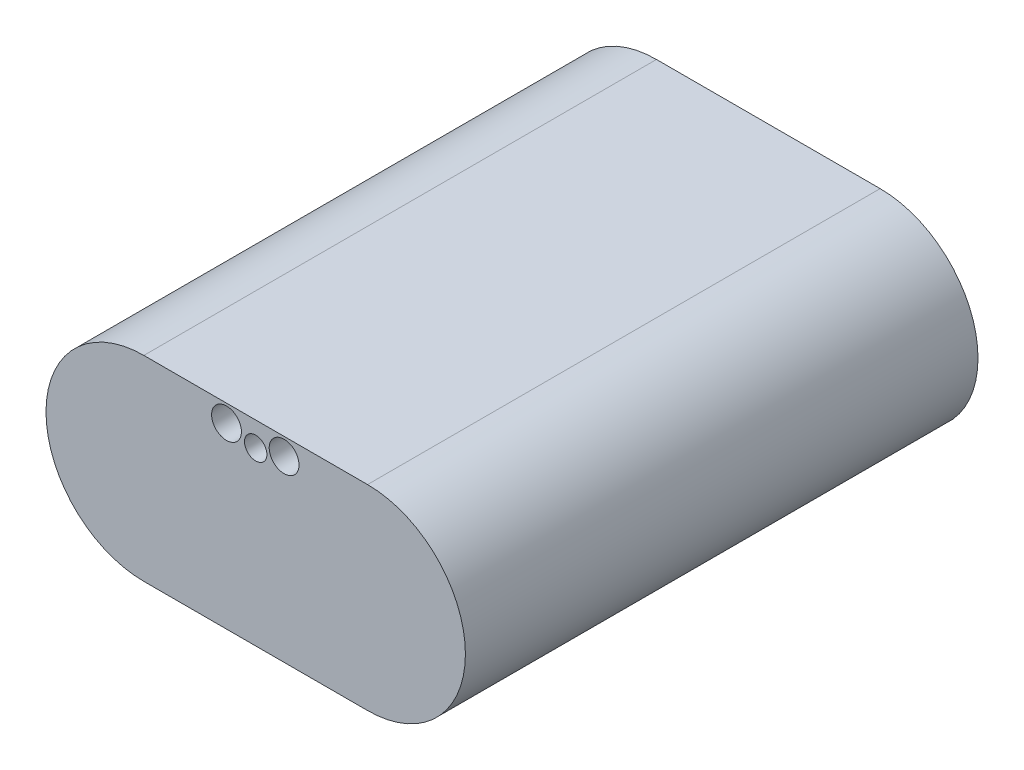
ISO-10303-21;
HEADER;
FILE_DESCRIPTION(('STEP AP214'),'2;1');
FILE_NAME('part.step','',(''),(''),'','','');
FILE_SCHEMA(('AUTOMOTIVE_DESIGN { 1 0 10303 214 1 1 1 1 }'));
ENDSEC;
DATA;
#1=APPLICATION_CONTEXT('core data for automotive mechanical design processes');
#2=APPLICATION_PROTOCOL_DEFINITION('international standard','automotive_design',2000,#1);
#3=PRODUCT_CONTEXT('',#1,'mechanical');
#4=PRODUCT('Part','Part','',(#3));
#5=PRODUCT_RELATED_PRODUCT_CATEGORY('part','',(#4));
#6=PRODUCT_DEFINITION_FORMATION('','',#4);
#7=PRODUCT_DEFINITION_CONTEXT('part definition',#1,'design');
#8=PRODUCT_DEFINITION('design','',#6,#7);
#9=PRODUCT_DEFINITION_SHAPE('','',#8);
#10=(LENGTH_UNIT() NAMED_UNIT(*) SI_UNIT(.MILLI.,.METRE.));
#11=(NAMED_UNIT(*) PLANE_ANGLE_UNIT() SI_UNIT($,.RADIAN.));
#12=(NAMED_UNIT(*) SI_UNIT($,.STERADIAN.) SOLID_ANGLE_UNIT());
#13=UNCERTAINTY_MEASURE_WITH_UNIT(LENGTH_MEASURE(1.E-05),#10,'distance_accuracy_value','');
#14=(GEOMETRIC_REPRESENTATION_CONTEXT(3) GLOBAL_UNCERTAINTY_ASSIGNED_CONTEXT((#13)) GLOBAL_UNIT_ASSIGNED_CONTEXT((#10,
#11,#12)) REPRESENTATION_CONTEXT('',''));
#15=CARTESIAN_POINT('',(0.,0.,0.));
#16=DIRECTION('',(0.,0.,1.));
#17=DIRECTION('',(1.,0.,0.));
#18=AXIS2_PLACEMENT_3D('',#15,#16,#17);
#19=CARTESIAN_POINT('',(-60.,0.,137.5));
#20=DIRECTION('',(0.,0.,-1.));
#21=DIRECTION('',(-1.,0.,0.));
#22=AXIS2_PLACEMENT_3D('',#19,#20,#21);
#23=CYLINDRICAL_SURFACE('',#22,52.5);
#24=CARTESIAN_POINT('',(-60.,0.,-137.5));
#25=DIRECTION('',(0.,0.,1.));
#26=DIRECTION('',(1.,0.,0.));
#27=AXIS2_PLACEMENT_3D('',#24,#25,#26);
#28=CIRCLE('',#27,52.5);
#29=CARTESIAN_POINT('',(-60.,52.5,-137.5));
#30=VERTEX_POINT('',#29);
#31=CARTESIAN_POINT('',(-60.,-52.5,-137.5));
#32=VERTEX_POINT('',#31);
#33=EDGE_CURVE('E117',#30,#32,#28,.T.);
#34=ORIENTED_EDGE('',*,*,#33,.T.);
#35=DIRECTION('',(0.,0.,-1.));
#36=VECTOR('',#35,1.);
#37=CARTESIAN_POINT('',(-60.,-52.5,137.5));
#38=LINE('',#37,#36);
#39=CARTESIAN_POINT('',(-60.,-52.5,137.5));
#40=VERTEX_POINT('',#39);
#41=EDGE_CURVE('E11',#40,#32,#38,.T.);
#42=ORIENTED_EDGE('',*,*,#41,.F.);
#43=CARTESIAN_POINT('',(-60.,0.,137.5));
#44=DIRECTION('',(0.,0.,1.));
#45=DIRECTION('',(1.,0.,0.));
#46=AXIS2_PLACEMENT_3D('',#43,#44,#45);
#47=CIRCLE('',#46,52.5);
#48=CARTESIAN_POINT('',(-60.,52.5,137.5));
#49=VERTEX_POINT('',#48);
#50=EDGE_CURVE('E93',#49,#40,#47,.T.);
#51=ORIENTED_EDGE('',*,*,#50,.F.);
#52=DIRECTION('',(0.,0.,-1.));
#53=VECTOR('',#52,1.);
#54=CARTESIAN_POINT('',(-60.,52.5,137.5));
#55=LINE('',#54,#53);
#56=EDGE_CURVE('E58',#49,#30,#55,.T.);
#57=ORIENTED_EDGE('',*,*,#56,.T.);
#58=EDGE_LOOP('',(#34,#42,#51,#57));
#59=FACE_BOUND('',#58,.T.);
#60=ADVANCED_FACE('F41',(#59),#23,.T.);
#61=CARTESIAN_POINT('',(0.,-52.5,137.5));
#62=DIRECTION('',(0.,1.,0.));
#63=DIRECTION('',(0.,0.,1.));
#64=AXIS2_PLACEMENT_3D('',#61,#62,#63);
#65=PLANE('',#64);
#66=DIRECTION('',(1.,0.,0.));
#67=VECTOR('',#66,1.);
#68=CARTESIAN_POINT('',(0.,-52.5,-137.5));
#69=LINE('',#68,#67);
#70=CARTESIAN_POINT('',(60.,-52.5,-137.5));
#71=VERTEX_POINT('',#70);
#72=EDGE_CURVE('E99',#32,#71,#69,.T.);
#73=ORIENTED_EDGE('',*,*,#72,.T.);
#74=DIRECTION('',(0.,0.,-1.));
#75=VECTOR('',#74,1.);
#76=CARTESIAN_POINT('',(60.,-52.5,137.5));
#77=LINE('',#76,#75);
#78=CARTESIAN_POINT('',(60.,-52.5,137.5));
#79=VERTEX_POINT('',#78);
#80=EDGE_CURVE('E50',#79,#71,#77,.T.);
#81=ORIENTED_EDGE('',*,*,#80,.F.);
#82=DIRECTION('',(1.,0.,0.));
#83=VECTOR('',#82,1.);
#84=CARTESIAN_POINT('',(0.,-52.5,137.5));
#85=LINE('',#84,#83);
#86=EDGE_CURVE('E85',#40,#79,#85,.T.);
#87=ORIENTED_EDGE('',*,*,#86,.F.);
#88=ORIENTED_EDGE('',*,*,#41,.T.);
#89=EDGE_LOOP('',(#73,#81,#87,#88));
#90=FACE_BOUND('',#89,.T.);
#91=ADVANCED_FACE('F98',(#90),#65,.F.);
#92=CARTESIAN_POINT('',(60.,0.,137.5));
#93=DIRECTION('',(0.,0.,-1.));
#94=DIRECTION('',(-1.,0.,0.));
#95=AXIS2_PLACEMENT_3D('',#92,#93,#94);
#96=CYLINDRICAL_SURFACE('',#95,52.5);
#97=CARTESIAN_POINT('',(60.,0.,-137.5));
#98=DIRECTION('',(0.,0.,1.));
#99=DIRECTION('',(1.,0.,0.));
#100=AXIS2_PLACEMENT_3D('',#97,#98,#99);
#101=CIRCLE('',#100,52.5);
#102=CARTESIAN_POINT('',(60.,52.5,-137.5));
#103=VERTEX_POINT('',#102);
#104=EDGE_CURVE('E120',#71,#103,#101,.T.);
#105=ORIENTED_EDGE('',*,*,#104,.T.);
#106=DIRECTION('',(0.,0.,-1.));
#107=VECTOR('',#106,1.);
#108=CARTESIAN_POINT('',(60.,52.5,137.5));
#109=LINE('',#108,#107);
#110=CARTESIAN_POINT('',(60.,52.5,137.5));
#111=VERTEX_POINT('',#110);
#112=EDGE_CURVE('E73',#111,#103,#109,.T.);
#113=ORIENTED_EDGE('',*,*,#112,.F.);
#114=CARTESIAN_POINT('',(60.,0.,137.5));
#115=DIRECTION('',(0.,0.,1.));
#116=DIRECTION('',(1.,0.,0.));
#117=AXIS2_PLACEMENT_3D('',#114,#115,#116);
#118=CIRCLE('',#117,52.5);
#119=EDGE_CURVE('E92',#79,#111,#118,.T.);
#120=ORIENTED_EDGE('',*,*,#119,.F.);
#121=ORIENTED_EDGE('',*,*,#80,.T.);
#122=EDGE_LOOP('',(#105,#113,#120,#121));
#123=FACE_BOUND('',#122,.T.);
#124=ADVANCED_FACE('F102',(#123),#96,.T.);
#125=CARTESIAN_POINT('',(15.2407029497933,43.1721546077025,137.5));
#126=DIRECTION('',(0.,0.,-1.));
#127=DIRECTION('',(-1.,0.,0.));
#128=AXIS2_PLACEMENT_3D('',#125,#126,#127);
#129=CYLINDRICAL_SURFACE('',#128,8.00000000000001);
#130=CARTESIAN_POINT('',(15.2407029497933,43.1721546077025,137.5));
#131=DIRECTION('',(0.,0.,1.));
#132=DIRECTION('',(1.,0.,0.));
#133=AXIS2_PLACEMENT_3D('',#130,#131,#132);
#134=CIRCLE('',#133,8.00000000000001);
#135=CARTESIAN_POINT('',(23.2407029497933,43.1721546077025,137.5));
#136=VERTEX_POINT('',#135);
#137=EDGE_CURVE('E111',#136,#136,#134,.T.);
#138=ORIENTED_EDGE('',*,*,#137,.T.);
#139=EDGE_LOOP('',(#138));
#140=FACE_BOUND('',#139,.T.);
#141=CARTESIAN_POINT('',(15.2407029497933,43.1721546077025,-137.5));
#142=DIRECTION('',(0.,0.,1.));
#143=DIRECTION('',(1.,0.,0.));
#144=AXIS2_PLACEMENT_3D('',#141,#142,#143);
#145=CIRCLE('',#144,8.00000000000001);
#146=CARTESIAN_POINT('',(23.2407029497933,43.1721546077025,-137.5));
#147=VERTEX_POINT('',#146);
#148=EDGE_CURVE('E128',#147,#147,#145,.T.);
#149=ORIENTED_EDGE('',*,*,#148,.F.);
#150=EDGE_LOOP('',(#149));
#151=FACE_BOUND('',#150,.T.);
#152=ADVANCED_FACE('F165',(#140,#151),#129,.F.);
#153=CARTESIAN_POINT('',(-15.6567845348491,43.1721546077025,137.5));
#154=DIRECTION('',(0.,0.,-1.));
#155=DIRECTION('',(-1.,0.,0.));
#156=AXIS2_PLACEMENT_3D('',#153,#154,#155);
#157=CYLINDRICAL_SURFACE('',#156,8.);
#158=CARTESIAN_POINT('',(-15.6567845348491,43.1721546077025,137.5));
#159=DIRECTION('',(0.,0.,1.));
#160=DIRECTION('',(1.,0.,0.));
#161=AXIS2_PLACEMENT_3D('',#158,#159,#160);
#162=CIRCLE('',#161,8.);
#163=CARTESIAN_POINT('',(-7.65678453484906,43.1721546077025,137.5));
#164=VERTEX_POINT('',#163);
#165=EDGE_CURVE('E105',#164,#164,#162,.T.);
#166=ORIENTED_EDGE('',*,*,#165,.T.);
#167=EDGE_LOOP('',(#166));
#168=FACE_BOUND('',#167,.T.);
#169=CARTESIAN_POINT('',(-15.6567845348491,43.1721546077025,-137.5));
#170=DIRECTION('',(0.,0.,1.));
#171=DIRECTION('',(1.,0.,0.));
#172=AXIS2_PLACEMENT_3D('',#169,#170,#171);
#173=CIRCLE('',#172,8.);
#174=CARTESIAN_POINT('',(-7.65678453484906,43.1721546077025,-137.5));
#175=VERTEX_POINT('',#174);
#176=EDGE_CURVE('E125',#175,#175,#173,.T.);
#177=ORIENTED_EDGE('',*,*,#176,.F.);
#178=EDGE_LOOP('',(#177));
#179=FACE_BOUND('',#178,.T.);
#180=ADVANCED_FACE('F150',(#168,#179),#157,.F.);
#181=CARTESIAN_POINT('',(0.,52.5,137.5));
#182=DIRECTION('',(0.,1.,0.));
#183=DIRECTION('',(-1.,0.,0.));
#184=AXIS2_PLACEMENT_3D('',#181,#182,#183);
#185=PLANE('',#184);
#186=DIRECTION('',(1.,0.,0.));
#187=VECTOR('',#186,1.);
#188=CARTESIAN_POINT('',(0.,52.5,-137.5));
#189=LINE('',#188,#187);
#190=EDGE_CURVE('E122',#30,#103,#189,.T.);
#191=ORIENTED_EDGE('',*,*,#190,.F.);
#192=ORIENTED_EDGE('',*,*,#56,.F.);
#193=DIRECTION('',(1.,0.,0.));
#194=VECTOR('',#193,1.);
#195=CARTESIAN_POINT('',(0.,52.5,137.5));
#196=LINE('',#195,#194);
#197=EDGE_CURVE('E103',#49,#111,#196,.T.);
#198=ORIENTED_EDGE('',*,*,#197,.T.);
#199=ORIENTED_EDGE('',*,*,#112,.T.);
#200=EDGE_LOOP('',(#191,#192,#198,#199));
#201=FACE_BOUND('',#200,.T.);
#202=ADVANCED_FACE('F142',(#201),#185,.T.);
#203=CARTESIAN_POINT('',(0.,39.4456176786118,137.5));
#204=DIRECTION('',(0.,0.,-1.));
#205=DIRECTION('',(-1.,0.,0.));
#206=AXIS2_PLACEMENT_3D('',#203,#204,#205);
#207=CYLINDRICAL_SURFACE('',#206,6.);
#208=CARTESIAN_POINT('',(0.,39.4456176786118,137.5));
#209=DIRECTION('',(0.,0.,1.));
#210=DIRECTION('',(1.,0.,0.));
#211=AXIS2_PLACEMENT_3D('',#208,#209,#210);
#212=CIRCLE('',#211,6.);
#213=CARTESIAN_POINT('',(6.,39.4456176786118,137.5));
#214=VERTEX_POINT('',#213);
#215=EDGE_CURVE('E114',#214,#214,#212,.T.);
#216=ORIENTED_EDGE('',*,*,#215,.T.);
#217=EDGE_LOOP('',(#216));
#218=FACE_BOUND('',#217,.T.);
#219=CARTESIAN_POINT('',(0.,39.4456176786118,-137.5));
#220=DIRECTION('',(0.,0.,1.));
#221=DIRECTION('',(1.,0.,0.));
#222=AXIS2_PLACEMENT_3D('',#219,#220,#221);
#223=CIRCLE('',#222,6.);
#224=CARTESIAN_POINT('',(6.,39.4456176786118,-137.5));
#225=VERTEX_POINT('',#224);
#226=EDGE_CURVE('E131',#225,#225,#223,.T.);
#227=ORIENTED_EDGE('',*,*,#226,.F.);
#228=EDGE_LOOP('',(#227));
#229=FACE_BOUND('',#228,.T.);
#230=ADVANCED_FACE('F140',(#218,#229),#207,.F.);
#231=CARTESIAN_POINT('',(0.,0.,137.5));
#232=DIRECTION('',(0.,0.,1.));
#233=DIRECTION('',(1.,0.,0.));
#234=AXIS2_PLACEMENT_3D('',#231,#232,#233);
#235=PLANE('',#234);
#236=ORIENTED_EDGE('',*,*,#50,.T.);
#237=ORIENTED_EDGE('',*,*,#86,.T.);
#238=ORIENTED_EDGE('',*,*,#119,.T.);
#239=ORIENTED_EDGE('',*,*,#197,.F.);
#240=EDGE_LOOP('',(#236,#237,#238,#239));
#241=FACE_BOUND('',#240,.T.);
#242=ORIENTED_EDGE('',*,*,#165,.F.);
#243=EDGE_LOOP('',(#242));
#244=FACE_BOUND('',#243,.T.);
#245=ORIENTED_EDGE('',*,*,#137,.F.);
#246=EDGE_LOOP('',(#245));
#247=FACE_BOUND('',#246,.T.);
#248=ORIENTED_EDGE('',*,*,#215,.F.);
#249=EDGE_LOOP('',(#248));
#250=FACE_BOUND('',#249,.T.);
#251=ADVANCED_FACE('F88',(#241,#244,#247,#250),#235,.T.);
#252=CARTESIAN_POINT('',(0.,0.,-137.5));
#253=DIRECTION('',(0.,0.,1.));
#254=DIRECTION('',(1.,0.,0.));
#255=AXIS2_PLACEMENT_3D('',#252,#253,#254);
#256=PLANE('',#255);
#257=ORIENTED_EDGE('',*,*,#33,.F.);
#258=ORIENTED_EDGE('',*,*,#190,.T.);
#259=ORIENTED_EDGE('',*,*,#104,.F.);
#260=ORIENTED_EDGE('',*,*,#72,.F.);
#261=EDGE_LOOP('',(#257,#258,#259,#260));
#262=FACE_BOUND('',#261,.T.);
#263=ORIENTED_EDGE('',*,*,#176,.T.);
#264=EDGE_LOOP('',(#263));
#265=FACE_BOUND('',#264,.T.);
#266=ORIENTED_EDGE('',*,*,#148,.T.);
#267=EDGE_LOOP('',(#266));
#268=FACE_BOUND('',#267,.T.);
#269=ORIENTED_EDGE('',*,*,#226,.T.);
#270=EDGE_LOOP('',(#269));
#271=FACE_BOUND('',#270,.T.);
#272=ADVANCED_FACE('F138',(#262,#265,#268,#271),#256,.F.);
#273=CLOSED_SHELL('',(#60,#91,#124,#152,#180,#202,#230,#251,#272));
#274=MANIFOLD_SOLID_BREP('B2',#273);
#275=ADVANCED_BREP_SHAPE_REPRESENTATION('',(#18,#274),#14);
#276=SHAPE_DEFINITION_REPRESENTATION(#9,#275);
ENDSEC;
END-ISO-10303-21;
